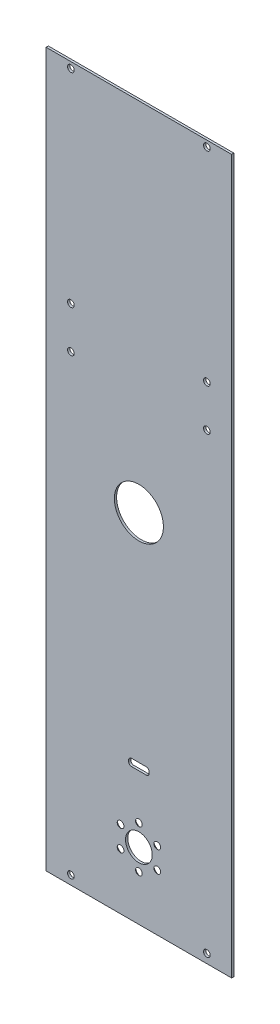
ISO-10303-21;
HEADER;
FILE_DESCRIPTION(('STEP AP214'),'2;1');
FILE_NAME('part.step','',(''),(''),'','','');
FILE_SCHEMA(('AUTOMOTIVE_DESIGN { 1 0 10303 214 1 1 1 1 }'));
ENDSEC;
DATA;
#1=APPLICATION_CONTEXT('core data for automotive mechanical design processes');
#2=APPLICATION_PROTOCOL_DEFINITION('international standard','automotive_design',2000,#1);
#3=PRODUCT_CONTEXT('',#1,'mechanical');
#4=PRODUCT('Part','Part','',(#3));
#5=PRODUCT_RELATED_PRODUCT_CATEGORY('part','',(#4));
#6=PRODUCT_DEFINITION_FORMATION('','',#4);
#7=PRODUCT_DEFINITION_CONTEXT('part definition',#1,'design');
#8=PRODUCT_DEFINITION('design','',#6,#7);
#9=PRODUCT_DEFINITION_SHAPE('','',#8);
#10=(LENGTH_UNIT() NAMED_UNIT(*) SI_UNIT(.MILLI.,.METRE.));
#11=(NAMED_UNIT(*) PLANE_ANGLE_UNIT() SI_UNIT($,.RADIAN.));
#12=(NAMED_UNIT(*) SI_UNIT($,.STERADIAN.) SOLID_ANGLE_UNIT());
#13=UNCERTAINTY_MEASURE_WITH_UNIT(LENGTH_MEASURE(1.E-05),#10,'distance_accuracy_value','');
#14=(GEOMETRIC_REPRESENTATION_CONTEXT(3) GLOBAL_UNCERTAINTY_ASSIGNED_CONTEXT((#13)) GLOBAL_UNIT_ASSIGNED_CONTEXT((#10,
#11,#12)) REPRESENTATION_CONTEXT('',''));
#15=CARTESIAN_POINT('',(0.,0.,0.));
#16=DIRECTION('',(0.,0.,1.));
#17=DIRECTION('',(1.,0.,0.));
#18=AXIS2_PLACEMENT_3D('',#15,#16,#17);
#19=CARTESIAN_POINT('',(-41.6,-160.,1.));
#20=DIRECTION('',(1.,0.,0.));
#21=DIRECTION('',(0.,0.,-1.));
#22=AXIS2_PLACEMENT_3D('',#19,#20,#21);
#23=PLANE('',#22);
#24=DIRECTION('',(0.,-1.,0.));
#25=VECTOR('',#24,1.);
#26=CARTESIAN_POINT('',(-41.6,-160.,0.));
#27=LINE('',#26,#25);
#28=CARTESIAN_POINT('',(-41.6,160.,0.));
#29=VERTEX_POINT('',#28);
#30=CARTESIAN_POINT('',(-41.6,-160.,0.));
#31=VERTEX_POINT('',#30);
#32=EDGE_CURVE('E266',#29,#31,#27,.T.);
#33=ORIENTED_EDGE('',*,*,#32,.T.);
#34=DIRECTION('',(0.,0.,-1.));
#35=VECTOR('',#34,1.);
#36=CARTESIAN_POINT('',(-41.6,-160.,1.));
#37=LINE('',#36,#35);
#38=CARTESIAN_POINT('',(-41.6,-160.,1.));
#39=VERTEX_POINT('',#38);
#40=EDGE_CURVE('E293',#39,#31,#37,.T.);
#41=ORIENTED_EDGE('',*,*,#40,.F.);
#42=DIRECTION('',(0.,-1.,0.));
#43=VECTOR('',#42,1.);
#44=CARTESIAN_POINT('',(-41.6,-160.,1.));
#45=LINE('',#44,#43);
#46=CARTESIAN_POINT('',(-41.6,160.,1.));
#47=VERTEX_POINT('',#46);
#48=EDGE_CURVE('E267',#47,#39,#45,.T.);
#49=ORIENTED_EDGE('',*,*,#48,.F.);
#50=DIRECTION('',(0.,0.,-1.));
#51=VECTOR('',#50,1.);
#52=CARTESIAN_POINT('',(-41.6,160.,1.));
#53=LINE('',#52,#51);
#54=EDGE_CURVE('E277',#47,#29,#53,.T.);
#55=ORIENTED_EDGE('',*,*,#54,.T.);
#56=EDGE_LOOP('',(#33,#41,#49,#55));
#57=FACE_BOUND('',#56,.T.);
#58=ADVANCED_FACE('F37',(#57),#23,.F.);
#59=CARTESIAN_POINT('',(41.6,-160.,1.));
#60=DIRECTION('',(0.,1.,0.));
#61=DIRECTION('',(-1.,0.,0.));
#62=AXIS2_PLACEMENT_3D('',#59,#60,#61);
#63=PLANE('',#62);
#64=DIRECTION('',(1.,0.,0.));
#65=VECTOR('',#64,1.);
#66=CARTESIAN_POINT('',(41.6,-160.,0.));
#67=LINE('',#66,#65);
#68=CARTESIAN_POINT('',(41.6,-160.,0.));
#69=VERTEX_POINT('',#68);
#70=EDGE_CURVE('E280',#31,#69,#67,.T.);
#71=ORIENTED_EDGE('',*,*,#70,.T.);
#72=DIRECTION('',(0.,0.,-1.));
#73=VECTOR('',#72,1.);
#74=CARTESIAN_POINT('',(41.6,-160.,1.));
#75=LINE('',#74,#73);
#76=CARTESIAN_POINT('',(41.6,-160.,1.));
#77=VERTEX_POINT('',#76);
#78=EDGE_CURVE('E290',#77,#69,#75,.T.);
#79=ORIENTED_EDGE('',*,*,#78,.F.);
#80=DIRECTION('',(1.,0.,0.));
#81=VECTOR('',#80,1.);
#82=CARTESIAN_POINT('',(41.6,-160.,1.));
#83=LINE('',#82,#81);
#84=EDGE_CURVE('E270',#39,#77,#83,.T.);
#85=ORIENTED_EDGE('',*,*,#84,.F.);
#86=ORIENTED_EDGE('',*,*,#40,.T.);
#87=EDGE_LOOP('',(#71,#79,#85,#86));
#88=FACE_BOUND('',#87,.T.);
#89=ADVANCED_FACE('F328',(#88),#63,.F.);
#90=CARTESIAN_POINT('',(41.6,-160.,1.));
#91=DIRECTION('',(-1.,0.,0.));
#92=DIRECTION('',(0.,0.,1.));
#93=AXIS2_PLACEMENT_3D('',#90,#91,#92);
#94=PLANE('',#93);
#95=DIRECTION('',(0.,1.,0.));
#96=VECTOR('',#95,1.);
#97=CARTESIAN_POINT('',(41.6,-160.,0.));
#98=LINE('',#97,#96);
#99=CARTESIAN_POINT('',(41.6,160.,0.));
#100=VERTEX_POINT('',#99);
#101=EDGE_CURVE('E282',#69,#100,#98,.T.);
#102=ORIENTED_EDGE('',*,*,#101,.T.);
#103=DIRECTION('',(0.,0.,-1.));
#104=VECTOR('',#103,1.);
#105=CARTESIAN_POINT('',(41.6,160.,1.));
#106=LINE('',#105,#104);
#107=CARTESIAN_POINT('',(41.6,160.,1.));
#108=VERTEX_POINT('',#107);
#109=EDGE_CURVE('E287',#108,#100,#106,.T.);
#110=ORIENTED_EDGE('',*,*,#109,.F.);
#111=DIRECTION('',(0.,1.,0.));
#112=VECTOR('',#111,1.);
#113=CARTESIAN_POINT('',(41.6,-160.,1.));
#114=LINE('',#113,#112);
#115=EDGE_CURVE('E273',#77,#108,#114,.T.);
#116=ORIENTED_EDGE('',*,*,#115,.F.);
#117=ORIENTED_EDGE('',*,*,#78,.T.);
#118=EDGE_LOOP('',(#102,#110,#116,#117));
#119=FACE_BOUND('',#118,.T.);
#120=ADVANCED_FACE('F334',(#119),#94,.F.);
#121=CARTESIAN_POINT('',(41.6,160.,1.));
#122=DIRECTION('',(0.,-1.,0.));
#123=DIRECTION('',(0.,0.,-1.));
#124=AXIS2_PLACEMENT_3D('',#121,#122,#123);
#125=PLANE('',#124);
#126=DIRECTION('',(-1.,0.,0.));
#127=VECTOR('',#126,1.);
#128=CARTESIAN_POINT('',(41.6,160.,0.));
#129=LINE('',#128,#127);
#130=EDGE_CURVE('E271',#100,#29,#129,.T.);
#131=ORIENTED_EDGE('',*,*,#130,.T.);
#132=ORIENTED_EDGE('',*,*,#54,.F.);
#133=DIRECTION('',(-1.,0.,0.));
#134=VECTOR('',#133,1.);
#135=CARTESIAN_POINT('',(41.6,160.,1.));
#136=LINE('',#135,#134);
#137=EDGE_CURVE('E275',#108,#47,#136,.T.);
#138=ORIENTED_EDGE('',*,*,#137,.F.);
#139=ORIENTED_EDGE('',*,*,#109,.T.);
#140=EDGE_LOOP('',(#131,#132,#138,#139));
#141=FACE_BOUND('',#140,.T.);
#142=ADVANCED_FACE('F393',(#141),#125,.F.);
#143=CARTESIAN_POINT('',(0.,0.,1.));
#144=DIRECTION('',(0.,0.,1.));
#145=DIRECTION('',(1.,0.,0.));
#146=AXIS2_PLACEMENT_3D('',#143,#144,#145);
#147=PLANE('',#146);
#148=CARTESIAN_POINT('',(3.29999999999995,-98.9966260203858,0.999999999999999));
#149=DIRECTION('',(0.,0.,1.));
#150=DIRECTION('',(1.,0.,0.));
#151=AXIS2_PLACEMENT_3D('',#148,#149,#150);
#152=CIRCLE('',#151,1.3);
#153=CARTESIAN_POINT('',(3.29999999999994,-100.296626020386,0.999999999999999));
#154=VERTEX_POINT('',#153);
#155=CARTESIAN_POINT('',(4.59999999999995,-98.9966260203858,0.999999999999999));
#156=VERTEX_POINT('',#155);
#157=EDGE_CURVE('E188',#154,#156,#152,.T.);
#158=ORIENTED_EDGE('',*,*,#157,.F.);
#159=DIRECTION('',(1.,0.,0.));
#160=VECTOR('',#159,1.);
#161=CARTESIAN_POINT('',(0.,-100.296626020386,1.));
#162=LINE('',#161,#160);
#163=CARTESIAN_POINT('',(-3.30000000000004,-100.296626020386,1.));
#164=VERTEX_POINT('',#163);
#165=EDGE_CURVE('E165',#164,#154,#162,.T.);
#166=ORIENTED_EDGE('',*,*,#165,.F.);
#167=CARTESIAN_POINT('',(-3.30000000000005,-98.9966260203858,0.999999999999999));
#168=DIRECTION('',(0.,0.,1.));
#169=DIRECTION('',(1.,0.,0.));
#170=AXIS2_PLACEMENT_3D('',#167,#168,#169);
#171=CIRCLE('',#170,1.3);
#172=CARTESIAN_POINT('',(-4.60000000000005,-98.9966260203858,0.999999999999999));
#173=VERTEX_POINT('',#172);
#174=EDGE_CURVE('E132',#173,#164,#171,.T.);
#175=ORIENTED_EDGE('',*,*,#174,.F.);
#176=DIRECTION('',(0.,-1.,0.));
#177=VECTOR('',#176,1.);
#178=CARTESIAN_POINT('',(-4.60000000000005,0.,1.));
#179=LINE('',#178,#177);
#180=CARTESIAN_POINT('',(-4.60000000000005,-98.3966260203858,0.999999999999999));
#181=VERTEX_POINT('',#180);
#182=EDGE_CURVE('E178',#181,#173,#179,.T.);
#183=ORIENTED_EDGE('',*,*,#182,.F.);
#184=CARTESIAN_POINT('',(-3.30000000000005,-98.3966260203858,0.999999999999999));
#185=DIRECTION('',(0.,0.,1.));
#186=DIRECTION('',(1.,0.,0.));
#187=AXIS2_PLACEMENT_3D('',#184,#185,#186);
#188=CIRCLE('',#187,1.3);
#189=CARTESIAN_POINT('',(-3.30000000000004,-97.0966260203858,0.999999999999999));
#190=VERTEX_POINT('',#189);
#191=EDGE_CURVE('E180',#190,#181,#188,.T.);
#192=ORIENTED_EDGE('',*,*,#191,.F.);
#193=DIRECTION('',(-1.,0.,0.));
#194=VECTOR('',#193,1.);
#195=CARTESIAN_POINT('',(0.,-97.0966260203858,1.));
#196=LINE('',#195,#194);
#197=CARTESIAN_POINT('',(3.29999999999994,-97.0966260203858,0.999999999999999));
#198=VERTEX_POINT('',#197);
#199=EDGE_CURVE('E182',#198,#190,#196,.T.);
#200=ORIENTED_EDGE('',*,*,#199,.F.);
#201=CARTESIAN_POINT('',(3.29999999999995,-98.3966260203858,0.999999999999999));
#202=DIRECTION('',(0.,0.,1.));
#203=DIRECTION('',(1.,0.,0.));
#204=AXIS2_PLACEMENT_3D('',#201,#202,#203);
#205=CIRCLE('',#204,1.3);
#206=CARTESIAN_POINT('',(4.59999999999995,-98.3966260203858,0.999999999999999));
#207=VERTEX_POINT('',#206);
#208=EDGE_CURVE('E184',#207,#198,#205,.T.);
#209=ORIENTED_EDGE('',*,*,#208,.F.);
#210=DIRECTION('',(0.,1.,0.));
#211=VECTOR('',#210,1.);
#212=CARTESIAN_POINT('',(4.59999999999995,0.,1.));
#213=LINE('',#212,#211);
#214=EDGE_CURVE('E186',#156,#207,#213,.T.);
#215=ORIENTED_EDGE('',*,*,#214,.F.);
#216=EDGE_LOOP('',(#158,#166,#175,#183,#192,#200,#209,#215));
#217=FACE_BOUND('',#216,.T.);
#218=CARTESIAN_POINT('',(8.22724133595211,-125.25,1.));
#219=DIRECTION('',(0.,0.,1.));
#220=DIRECTION('',(0.50000000000001,-0.866025403784433,0.));
#221=AXIS2_PLACEMENT_3D('',#218,#219,#220);
#222=CIRCLE('',#221,1.5);
#223=CARTESIAN_POINT('',(8.97724133595213,-126.549038105677,1.));
#224=VERTEX_POINT('',#223);
#225=EDGE_CURVE('E190',#224,#224,#222,.T.);
#226=ORIENTED_EDGE('',*,*,#225,.F.);
#227=EDGE_LOOP('',(#226));
#228=FACE_BOUND('',#227,.T.);
#229=CARTESIAN_POINT('',(8.22724133595221,-134.75,1.));
#230=DIRECTION('',(0.,0.,1.));
#231=DIRECTION('',(-0.499999999999992,-0.866025403784443,0.));
#232=AXIS2_PLACEMENT_3D('',#229,#230,#231);
#233=CIRCLE('',#232,1.5);
#234=CARTESIAN_POINT('',(7.47724133595222,-136.049038105677,1.));
#235=VERTEX_POINT('',#234);
#236=EDGE_CURVE('E198',#235,#235,#233,.T.);
#237=ORIENTED_EDGE('',*,*,#236,.F.);
#238=EDGE_LOOP('',(#237));
#239=FACE_BOUND('',#238,.T.);
#240=CARTESIAN_POINT('',(0.,-139.5,1.));
#241=DIRECTION('',(0.,0.,1.));
#242=DIRECTION('',(-1.,0.,0.));
#243=AXIS2_PLACEMENT_3D('',#240,#241,#242);
#244=CIRCLE('',#243,1.5);
#245=CARTESIAN_POINT('',(-1.5,-139.5,1.));
#246=VERTEX_POINT('',#245);
#247=EDGE_CURVE('E195',#246,#246,#244,.T.);
#248=ORIENTED_EDGE('',*,*,#247,.F.);
#249=EDGE_LOOP('',(#248));
#250=FACE_BOUND('',#249,.T.);
#251=CARTESIAN_POINT('',(-8.22724133595214,-134.75,1.));
#252=DIRECTION('',(0.,0.,1.));
#253=DIRECTION('',(-0.500000000000004,0.866025403784436,0.));
#254=AXIS2_PLACEMENT_3D('',#251,#252,#253);
#255=CIRCLE('',#254,1.5);
#256=CARTESIAN_POINT('',(-8.97724133595214,-133.450961894323,1.));
#257=VERTEX_POINT('',#256);
#258=EDGE_CURVE('E191',#257,#257,#255,.T.);
#259=ORIENTED_EDGE('',*,*,#258,.F.);
#260=EDGE_LOOP('',(#259));
#261=FACE_BOUND('',#260,.T.);
#262=CARTESIAN_POINT('',(-8.22724133595217,-125.25,1.));
#263=DIRECTION('',(0.,0.,1.));
#264=DIRECTION('',(0.499999999999998,0.86602540378444,0.));
#265=AXIS2_PLACEMENT_3D('',#262,#263,#264);
#266=CIRCLE('',#265,1.5);
#267=CARTESIAN_POINT('',(-7.47724133595217,-123.950961894323,1.));
#268=VERTEX_POINT('',#267);
#269=EDGE_CURVE('E194',#268,#268,#266,.T.);
#270=ORIENTED_EDGE('',*,*,#269,.F.);
#271=EDGE_LOOP('',(#270));
#272=FACE_BOUND('',#271,.T.);
#273=CARTESIAN_POINT('',(0.,-120.5,1.));
#274=DIRECTION('',(0.,0.,1.));
#275=DIRECTION('',(1.,0.,0.));
#276=AXIS2_PLACEMENT_3D('',#273,#274,#275);
#277=CIRCLE('',#276,1.5);
#278=CARTESIAN_POINT('',(1.5,-120.5,1.));
#279=VERTEX_POINT('',#278);
#280=EDGE_CURVE('E205',#279,#279,#277,.T.);
#281=ORIENTED_EDGE('',*,*,#280,.F.);
#282=EDGE_LOOP('',(#281));
#283=FACE_BOUND('',#282,.T.);
#284=CARTESIAN_POINT('',(0.,-130.,1.));
#285=DIRECTION('',(0.,0.,1.));
#286=DIRECTION('',(1.,0.,0.));
#287=AXIS2_PLACEMENT_3D('',#284,#285,#286);
#288=CIRCLE('',#287,6.);
#289=CARTESIAN_POINT('',(6.,-130.,1.));
#290=VERTEX_POINT('',#289);
#291=EDGE_CURVE('E208',#290,#290,#288,.T.);
#292=ORIENTED_EDGE('',*,*,#291,.F.);
#293=EDGE_LOOP('',(#292));
#294=FACE_BOUND('',#293,.T.);
#295=CARTESIAN_POINT('',(0.,0.,1.));
#296=DIRECTION('',(0.,0.,1.));
#297=DIRECTION('',(1.,0.,0.));
#298=AXIS2_PLACEMENT_3D('',#295,#296,#297);
#299=CIRCLE('',#298,11.);
#300=CARTESIAN_POINT('',(11.,0.,1.));
#301=VERTEX_POINT('',#300);
#302=EDGE_CURVE('E216',#301,#301,#299,.T.);
#303=ORIENTED_EDGE('',*,*,#302,.F.);
#304=EDGE_LOOP('',(#303));
#305=FACE_BOUND('',#304,.T.);
#306=CARTESIAN_POINT('',(-30.5,65.9999999999997,1.));
#307=DIRECTION('',(0.,0.,1.));
#308=DIRECTION('',(1.,0.,0.));
#309=AXIS2_PLACEMENT_3D('',#306,#307,#308);
#310=CIRCLE('',#309,1.5);
#311=CARTESIAN_POINT('',(-29.,65.9999999999997,1.));
#312=VERTEX_POINT('',#311);
#313=EDGE_CURVE('E215',#312,#312,#310,.T.);
#314=ORIENTED_EDGE('',*,*,#313,.F.);
#315=EDGE_LOOP('',(#314));
#316=FACE_BOUND('',#315,.T.);
#317=CARTESIAN_POINT('',(30.5,65.9999999999994,1.));
#318=DIRECTION('',(0.,0.,1.));
#319=DIRECTION('',(1.,0.,0.));
#320=AXIS2_PLACEMENT_3D('',#317,#318,#319);
#321=CIRCLE('',#320,1.5);
#322=CARTESIAN_POINT('',(32.,65.9999999999994,1.));
#323=VERTEX_POINT('',#322);
#324=EDGE_CURVE('E224',#323,#323,#321,.T.);
#325=ORIENTED_EDGE('',*,*,#324,.F.);
#326=EDGE_LOOP('',(#325));
#327=FACE_BOUND('',#326,.T.);
#328=CARTESIAN_POINT('',(30.5,-156.,1.));
#329=DIRECTION('',(0.,0.,1.));
#330=DIRECTION('',(1.,0.,0.));
#331=AXIS2_PLACEMENT_3D('',#328,#329,#330);
#332=CIRCLE('',#331,1.5);
#333=CARTESIAN_POINT('',(32.,-156.,1.));
#334=VERTEX_POINT('',#333);
#335=EDGE_CURVE('E230',#334,#334,#332,.T.);
#336=ORIENTED_EDGE('',*,*,#335,.F.);
#337=EDGE_LOOP('',(#336));
#338=FACE_BOUND('',#337,.T.);
#339=CARTESIAN_POINT('',(-30.5,-156.,1.));
#340=DIRECTION('',(0.,0.,1.));
#341=DIRECTION('',(1.,0.,0.));
#342=AXIS2_PLACEMENT_3D('',#339,#340,#341);
#343=CIRCLE('',#342,1.5);
#344=CARTESIAN_POINT('',(-29.,-156.,1.));
#345=VERTEX_POINT('',#344);
#346=EDGE_CURVE('E236',#345,#345,#343,.T.);
#347=ORIENTED_EDGE('',*,*,#346,.F.);
#348=EDGE_LOOP('',(#347));
#349=FACE_BOUND('',#348,.T.);
#350=CARTESIAN_POINT('',(-30.5,157.3,1.));
#351=DIRECTION('',(0.,0.,1.));
#352=DIRECTION('',(1.,0.,0.));
#353=AXIS2_PLACEMENT_3D('',#350,#351,#352);
#354=CIRCLE('',#353,1.5);
#355=CARTESIAN_POINT('',(-29.,157.3,1.));
#356=VERTEX_POINT('',#355);
#357=EDGE_CURVE('E242',#356,#356,#354,.T.);
#358=ORIENTED_EDGE('',*,*,#357,.F.);
#359=EDGE_LOOP('',(#358));
#360=FACE_BOUND('',#359,.T.);
#361=CARTESIAN_POINT('',(30.5,157.3,1.));
#362=DIRECTION('',(0.,0.,1.));
#363=DIRECTION('',(1.,0.,0.));
#364=AXIS2_PLACEMENT_3D('',#361,#362,#363);
#365=CIRCLE('',#364,1.5);
#366=CARTESIAN_POINT('',(32.,157.3,1.));
#367=VERTEX_POINT('',#366);
#368=EDGE_CURVE('E248',#367,#367,#365,.T.);
#369=ORIENTED_EDGE('',*,*,#368,.F.);
#370=EDGE_LOOP('',(#369));
#371=FACE_BOUND('',#370,.T.);
#372=CARTESIAN_POINT('',(-30.5000000000001,47.3,1.));
#373=DIRECTION('',(0.,0.,1.));
#374=DIRECTION('',(1.,0.,0.));
#375=AXIS2_PLACEMENT_3D('',#372,#373,#374);
#376=CIRCLE('',#375,1.5);
#377=CARTESIAN_POINT('',(-29.0000000000001,47.3,1.));
#378=VERTEX_POINT('',#377);
#379=EDGE_CURVE('E254',#378,#378,#376,.T.);
#380=ORIENTED_EDGE('',*,*,#379,.F.);
#381=EDGE_LOOP('',(#380));
#382=FACE_BOUND('',#381,.T.);
#383=CARTESIAN_POINT('',(30.5,47.3000000000001,1.));
#384=DIRECTION('',(0.,0.,1.));
#385=DIRECTION('',(1.,0.,0.));
#386=AXIS2_PLACEMENT_3D('',#383,#384,#385);
#387=CIRCLE('',#386,1.5);
#388=CARTESIAN_POINT('',(32.,47.3000000000001,1.));
#389=VERTEX_POINT('',#388);
#390=EDGE_CURVE('E260',#389,#389,#387,.T.);
#391=ORIENTED_EDGE('',*,*,#390,.F.);
#392=EDGE_LOOP('',(#391));
#393=FACE_BOUND('',#392,.T.);
#394=ORIENTED_EDGE('',*,*,#48,.T.);
#395=ORIENTED_EDGE('',*,*,#84,.T.);
#396=ORIENTED_EDGE('',*,*,#115,.T.);
#397=ORIENTED_EDGE('',*,*,#137,.T.);
#398=EDGE_LOOP('',(#394,#395,#396,#397));
#399=FACE_BOUND('',#398,.T.);
#400=ADVANCED_FACE('F359',(#217,#228,#239,#250,#261,#272,#283,#294,#305,#316,#327,#338,#349,
#360,#371,#382,#393,#399),#147,.T.);
#401=CARTESIAN_POINT('',(0.,0.,0.));
#402=DIRECTION('',(0.,0.,1.));
#403=DIRECTION('',(1.,0.,0.));
#404=AXIS2_PLACEMENT_3D('',#401,#402,#403);
#405=PLANE('',#404);
#406=DIRECTION('',(-1.,0.,0.));
#407=VECTOR('',#406,1.);
#408=CARTESIAN_POINT('',(3.29999999999994,-100.296626020386,0.));
#409=LINE('',#408,#407);
#410=CARTESIAN_POINT('',(3.29999999999994,-100.296626020386,0.));
#411=VERTEX_POINT('',#410);
#412=CARTESIAN_POINT('',(-3.30000000000004,-100.296626020386,0.));
#413=VERTEX_POINT('',#412);
#414=EDGE_CURVE('E138',#411,#413,#409,.T.);
#415=ORIENTED_EDGE('',*,*,#414,.F.);
#416=CARTESIAN_POINT('',(3.29999999999995,-98.9966260203858,0.));
#417=DIRECTION('',(0.,0.,-1.));
#418=DIRECTION('',(-1.,0.,0.));
#419=AXIS2_PLACEMENT_3D('',#416,#417,#418);
#420=CIRCLE('',#419,1.3);
#421=CARTESIAN_POINT('',(4.59999999999995,-98.9966260203858,0.));
#422=VERTEX_POINT('',#421);
#423=EDGE_CURVE('E60',#422,#411,#420,.T.);
#424=ORIENTED_EDGE('',*,*,#423,.F.);
#425=DIRECTION('',(0.,-1.,0.));
#426=VECTOR('',#425,1.);
#427=CARTESIAN_POINT('',(4.59999999999995,-98.9966260203858,0.));
#428=LINE('',#427,#426);
#429=CARTESIAN_POINT('',(4.59999999999995,-98.3966260203858,0.));
#430=VERTEX_POINT('',#429);
#431=EDGE_CURVE('E160',#430,#422,#428,.T.);
#432=ORIENTED_EDGE('',*,*,#431,.F.);
#433=CARTESIAN_POINT('',(3.29999999999995,-98.3966260203858,0.));
#434=DIRECTION('',(0.,0.,-1.));
#435=DIRECTION('',(1.,0.,0.));
#436=AXIS2_PLACEMENT_3D('',#433,#434,#435);
#437=CIRCLE('',#436,1.3);
#438=CARTESIAN_POINT('',(3.29999999999994,-97.0966260203858,0.));
#439=VERTEX_POINT('',#438);
#440=EDGE_CURVE('E157',#439,#430,#437,.T.);
#441=ORIENTED_EDGE('',*,*,#440,.F.);
#442=DIRECTION('',(1.,0.,0.));
#443=VECTOR('',#442,1.);
#444=CARTESIAN_POINT('',(3.29999999999994,-97.0966260203858,0.));
#445=LINE('',#444,#443);
#446=CARTESIAN_POINT('',(-3.30000000000004,-97.0966260203858,0.));
#447=VERTEX_POINT('',#446);
#448=EDGE_CURVE('E154',#447,#439,#445,.T.);
#449=ORIENTED_EDGE('',*,*,#448,.F.);
#450=CARTESIAN_POINT('',(-3.30000000000005,-98.3966260203858,0.));
#451=DIRECTION('',(0.,0.,-1.));
#452=DIRECTION('',(-1.,0.,0.));
#453=AXIS2_PLACEMENT_3D('',#450,#451,#452);
#454=CIRCLE('',#453,1.3);
#455=CARTESIAN_POINT('',(-4.60000000000005,-98.3966260203858,0.));
#456=VERTEX_POINT('',#455);
#457=EDGE_CURVE('E148',#456,#447,#454,.T.);
#458=ORIENTED_EDGE('',*,*,#457,.F.);
#459=DIRECTION('',(0.,1.,0.));
#460=VECTOR('',#459,1.);
#461=CARTESIAN_POINT('',(-4.60000000000005,-98.9966260203858,0.));
#462=LINE('',#461,#460);
#463=CARTESIAN_POINT('',(-4.60000000000005,-98.9966260203858,0.));
#464=VERTEX_POINT('',#463);
#465=EDGE_CURVE('E146',#464,#456,#462,.T.);
#466=ORIENTED_EDGE('',*,*,#465,.F.);
#467=CARTESIAN_POINT('',(-3.30000000000005,-98.9966260203858,0.));
#468=DIRECTION('',(0.,0.,-1.));
#469=DIRECTION('',(-1.,0.,0.));
#470=AXIS2_PLACEMENT_3D('',#467,#468,#469);
#471=CIRCLE('',#470,1.3);
#472=EDGE_CURVE('E129',#413,#464,#471,.T.);
#473=ORIENTED_EDGE('',*,*,#472,.F.);
#474=EDGE_LOOP('',(#415,#424,#432,#441,#449,#458,#466,#473));
#475=FACE_BOUND('',#474,.T.);
#476=CARTESIAN_POINT('',(8.22724133595211,-125.25,0.));
#477=DIRECTION('',(0.,0.,1.));
#478=DIRECTION('',(1.,0.,0.));
#479=AXIS2_PLACEMENT_3D('',#476,#477,#478);
#480=CIRCLE('',#479,2.5);
#481=CARTESIAN_POINT('',(10.7272413359521,-125.25,0.));
#482=VERTEX_POINT('',#481);
#483=EDGE_CURVE('E11',#482,#482,#480,.T.);
#484=ORIENTED_EDGE('',*,*,#483,.T.);
#485=EDGE_LOOP('',(#484));
#486=FACE_BOUND('',#485,.T.);
#487=CARTESIAN_POINT('',(8.22724133595221,-134.75,0.));
#488=DIRECTION('',(0.,0.,1.));
#489=DIRECTION('',(1.,0.,0.));
#490=AXIS2_PLACEMENT_3D('',#487,#488,#489);
#491=CIRCLE('',#490,2.5);
#492=CARTESIAN_POINT('',(10.7272413359522,-134.75,0.));
#493=VERTEX_POINT('',#492);
#494=EDGE_CURVE('E45',#493,#493,#491,.T.);
#495=ORIENTED_EDGE('',*,*,#494,.T.);
#496=EDGE_LOOP('',(#495));
#497=FACE_BOUND('',#496,.T.);
#498=CARTESIAN_POINT('',(0.,-139.5,0.));
#499=DIRECTION('',(0.,0.,1.));
#500=DIRECTION('',(1.,0.,0.));
#501=AXIS2_PLACEMENT_3D('',#498,#499,#500);
#502=CIRCLE('',#501,2.5);
#503=CARTESIAN_POINT('',(2.5,-139.5,0.));
#504=VERTEX_POINT('',#503);
#505=EDGE_CURVE('E307',#504,#504,#502,.T.);
#506=ORIENTED_EDGE('',*,*,#505,.T.);
#507=EDGE_LOOP('',(#506));
#508=FACE_BOUND('',#507,.T.);
#509=CARTESIAN_POINT('',(-8.22724133595214,-134.75,0.));
#510=DIRECTION('',(0.,0.,1.));
#511=DIRECTION('',(1.,0.,0.));
#512=AXIS2_PLACEMENT_3D('',#509,#510,#511);
#513=CIRCLE('',#512,2.5);
#514=CARTESIAN_POINT('',(-5.72724133595213,-134.75,0.));
#515=VERTEX_POINT('',#514);
#516=EDGE_CURVE('E304',#515,#515,#513,.T.);
#517=ORIENTED_EDGE('',*,*,#516,.T.);
#518=EDGE_LOOP('',(#517));
#519=FACE_BOUND('',#518,.T.);
#520=CARTESIAN_POINT('',(-8.22724133595217,-125.25,0.));
#521=DIRECTION('',(0.,0.,1.));
#522=DIRECTION('',(1.,0.,0.));
#523=AXIS2_PLACEMENT_3D('',#520,#521,#522);
#524=CIRCLE('',#523,2.5);
#525=CARTESIAN_POINT('',(-5.72724133595216,-125.25,0.));
#526=VERTEX_POINT('',#525);
#527=EDGE_CURVE('E301',#526,#526,#524,.T.);
#528=ORIENTED_EDGE('',*,*,#527,.T.);
#529=EDGE_LOOP('',(#528));
#530=FACE_BOUND('',#529,.T.);
#531=CARTESIAN_POINT('',(0.,-120.5,0.));
#532=DIRECTION('',(0.,0.,1.));
#533=DIRECTION('',(1.,0.,0.));
#534=AXIS2_PLACEMENT_3D('',#531,#532,#533);
#535=CIRCLE('',#534,2.5);
#536=CARTESIAN_POINT('',(2.5,-120.5,0.));
#537=VERTEX_POINT('',#536);
#538=EDGE_CURVE('E296',#537,#537,#535,.T.);
#539=ORIENTED_EDGE('',*,*,#538,.T.);
#540=EDGE_LOOP('',(#539));
#541=FACE_BOUND('',#540,.T.);
#542=CARTESIAN_POINT('',(0.,-130.,0.));
#543=DIRECTION('',(0.,0.,1.));
#544=DIRECTION('',(1.,0.,0.));
#545=AXIS2_PLACEMENT_3D('',#542,#543,#544);
#546=CIRCLE('',#545,6.);
#547=CARTESIAN_POINT('',(6.,-130.,0.));
#548=VERTEX_POINT('',#547);
#549=EDGE_CURVE('E211',#548,#548,#546,.T.);
#550=ORIENTED_EDGE('',*,*,#549,.T.);
#551=EDGE_LOOP('',(#550));
#552=FACE_BOUND('',#551,.T.);
#553=CARTESIAN_POINT('',(0.,0.,0.));
#554=DIRECTION('',(0.,0.,1.));
#555=DIRECTION('',(1.,0.,0.));
#556=AXIS2_PLACEMENT_3D('',#553,#554,#555);
#557=CIRCLE('',#556,11.);
#558=CARTESIAN_POINT('',(11.,0.,0.));
#559=VERTEX_POINT('',#558);
#560=EDGE_CURVE('E212',#559,#559,#557,.T.);
#561=ORIENTED_EDGE('',*,*,#560,.T.);
#562=EDGE_LOOP('',(#561));
#563=FACE_BOUND('',#562,.T.);
#564=CARTESIAN_POINT('',(-30.5,65.9999999999997,0.));
#565=DIRECTION('',(0.,0.,1.));
#566=DIRECTION('',(1.,0.,0.));
#567=AXIS2_PLACEMENT_3D('',#564,#565,#566);
#568=CIRCLE('',#567,1.5);
#569=CARTESIAN_POINT('',(-29.,65.9999999999997,0.));
#570=VERTEX_POINT('',#569);
#571=EDGE_CURVE('E221',#570,#570,#568,.T.);
#572=ORIENTED_EDGE('',*,*,#571,.T.);
#573=EDGE_LOOP('',(#572));
#574=FACE_BOUND('',#573,.T.);
#575=CARTESIAN_POINT('',(30.5,65.9999999999994,0.));
#576=DIRECTION('',(0.,0.,1.));
#577=DIRECTION('',(1.,0.,0.));
#578=AXIS2_PLACEMENT_3D('',#575,#576,#577);
#579=CIRCLE('',#578,1.5);
#580=CARTESIAN_POINT('',(32.,65.9999999999994,0.));
#581=VERTEX_POINT('',#580);
#582=EDGE_CURVE('E227',#581,#581,#579,.T.);
#583=ORIENTED_EDGE('',*,*,#582,.T.);
#584=EDGE_LOOP('',(#583));
#585=FACE_BOUND('',#584,.T.);
#586=CARTESIAN_POINT('',(30.5,-156.,0.));
#587=DIRECTION('',(0.,0.,1.));
#588=DIRECTION('',(1.,0.,0.));
#589=AXIS2_PLACEMENT_3D('',#586,#587,#588);
#590=CIRCLE('',#589,1.5);
#591=CARTESIAN_POINT('',(32.,-156.,0.));
#592=VERTEX_POINT('',#591);
#593=EDGE_CURVE('E233',#592,#592,#590,.T.);
#594=ORIENTED_EDGE('',*,*,#593,.T.);
#595=EDGE_LOOP('',(#594));
#596=FACE_BOUND('',#595,.T.);
#597=CARTESIAN_POINT('',(-30.5,-156.,0.));
#598=DIRECTION('',(0.,0.,1.));
#599=DIRECTION('',(1.,0.,0.));
#600=AXIS2_PLACEMENT_3D('',#597,#598,#599);
#601=CIRCLE('',#600,1.5);
#602=CARTESIAN_POINT('',(-29.,-156.,0.));
#603=VERTEX_POINT('',#602);
#604=EDGE_CURVE('E239',#603,#603,#601,.T.);
#605=ORIENTED_EDGE('',*,*,#604,.T.);
#606=EDGE_LOOP('',(#605));
#607=FACE_BOUND('',#606,.T.);
#608=CARTESIAN_POINT('',(-30.5,157.3,0.));
#609=DIRECTION('',(0.,0.,1.));
#610=DIRECTION('',(1.,0.,0.));
#611=AXIS2_PLACEMENT_3D('',#608,#609,#610);
#612=CIRCLE('',#611,1.5);
#613=CARTESIAN_POINT('',(-29.,157.3,0.));
#614=VERTEX_POINT('',#613);
#615=EDGE_CURVE('E245',#614,#614,#612,.T.);
#616=ORIENTED_EDGE('',*,*,#615,.T.);
#617=EDGE_LOOP('',(#616));
#618=FACE_BOUND('',#617,.T.);
#619=CARTESIAN_POINT('',(30.5,157.3,0.));
#620=DIRECTION('',(0.,0.,1.));
#621=DIRECTION('',(1.,0.,0.));
#622=AXIS2_PLACEMENT_3D('',#619,#620,#621);
#623=CIRCLE('',#622,1.5);
#624=CARTESIAN_POINT('',(32.,157.3,0.));
#625=VERTEX_POINT('',#624);
#626=EDGE_CURVE('E251',#625,#625,#623,.T.);
#627=ORIENTED_EDGE('',*,*,#626,.T.);
#628=EDGE_LOOP('',(#627));
#629=FACE_BOUND('',#628,.T.);
#630=CARTESIAN_POINT('',(-30.5000000000001,47.3,0.));
#631=DIRECTION('',(0.,0.,1.));
#632=DIRECTION('',(1.,0.,0.));
#633=AXIS2_PLACEMENT_3D('',#630,#631,#632);
#634=CIRCLE('',#633,1.5);
#635=CARTESIAN_POINT('',(-29.0000000000001,47.3,0.));
#636=VERTEX_POINT('',#635);
#637=EDGE_CURVE('E257',#636,#636,#634,.T.);
#638=ORIENTED_EDGE('',*,*,#637,.T.);
#639=EDGE_LOOP('',(#638));
#640=FACE_BOUND('',#639,.T.);
#641=CARTESIAN_POINT('',(30.5,47.3000000000001,0.));
#642=DIRECTION('',(0.,0.,1.));
#643=DIRECTION('',(1.,0.,0.));
#644=AXIS2_PLACEMENT_3D('',#641,#642,#643);
#645=CIRCLE('',#644,1.5);
#646=CARTESIAN_POINT('',(32.,47.3000000000001,0.));
#647=VERTEX_POINT('',#646);
#648=EDGE_CURVE('E263',#647,#647,#645,.T.);
#649=ORIENTED_EDGE('',*,*,#648,.T.);
#650=EDGE_LOOP('',(#649));
#651=FACE_BOUND('',#650,.T.);
#652=ORIENTED_EDGE('',*,*,#32,.F.);
#653=ORIENTED_EDGE('',*,*,#130,.F.);
#654=ORIENTED_EDGE('',*,*,#101,.F.);
#655=ORIENTED_EDGE('',*,*,#70,.F.);
#656=EDGE_LOOP('',(#652,#653,#654,#655));
#657=FACE_BOUND('',#656,.T.);
#658=ADVANCED_FACE('F142',(#475,#486,#497,#508,#519,#530,#541,#552,#563,#574,#585,#596,#607,
#618,#629,#640,#651,#657),#405,.F.);
#659=CARTESIAN_POINT('',(30.5,47.3000000000001,1.));
#660=DIRECTION('',(0.,0.,1.));
#661=DIRECTION('',(1.,0.,0.));
#662=AXIS2_PLACEMENT_3D('',#659,#660,#661);
#663=CYLINDRICAL_SURFACE('',#662,1.5);
#664=ORIENTED_EDGE('',*,*,#648,.F.);
#665=EDGE_LOOP('',(#664));
#666=FACE_BOUND('',#665,.T.);
#667=ORIENTED_EDGE('',*,*,#390,.T.);
#668=EDGE_LOOP('',(#667));
#669=FACE_BOUND('',#668,.T.);
#670=ADVANCED_FACE('F358',(#666,#669),#663,.F.);
#671=CARTESIAN_POINT('',(-30.5000000000001,47.3,1.));
#672=DIRECTION('',(0.,0.,1.));
#673=DIRECTION('',(1.,0.,0.));
#674=AXIS2_PLACEMENT_3D('',#671,#672,#673);
#675=CYLINDRICAL_SURFACE('',#674,1.5);
#676=ORIENTED_EDGE('',*,*,#637,.F.);
#677=EDGE_LOOP('',(#676));
#678=FACE_BOUND('',#677,.T.);
#679=ORIENTED_EDGE('',*,*,#379,.T.);
#680=EDGE_LOOP('',(#679));
#681=FACE_BOUND('',#680,.T.);
#682=ADVANCED_FACE('F438',(#678,#681),#675,.F.);
#683=CARTESIAN_POINT('',(30.5,157.3,1.));
#684=DIRECTION('',(0.,0.,1.));
#685=DIRECTION('',(1.,0.,0.));
#686=AXIS2_PLACEMENT_3D('',#683,#684,#685);
#687=CYLINDRICAL_SURFACE('',#686,1.5);
#688=ORIENTED_EDGE('',*,*,#626,.F.);
#689=EDGE_LOOP('',(#688));
#690=FACE_BOUND('',#689,.T.);
#691=ORIENTED_EDGE('',*,*,#368,.T.);
#692=EDGE_LOOP('',(#691));
#693=FACE_BOUND('',#692,.T.);
#694=ADVANCED_FACE('F444',(#690,#693),#687,.F.);
#695=CARTESIAN_POINT('',(-30.5,157.3,1.));
#696=DIRECTION('',(0.,0.,1.));
#697=DIRECTION('',(1.,0.,0.));
#698=AXIS2_PLACEMENT_3D('',#695,#696,#697);
#699=CYLINDRICAL_SURFACE('',#698,1.5);
#700=ORIENTED_EDGE('',*,*,#615,.F.);
#701=EDGE_LOOP('',(#700));
#702=FACE_BOUND('',#701,.T.);
#703=ORIENTED_EDGE('',*,*,#357,.T.);
#704=EDGE_LOOP('',(#703));
#705=FACE_BOUND('',#704,.T.);
#706=ADVANCED_FACE('F451',(#702,#705),#699,.F.);
#707=CARTESIAN_POINT('',(-30.5,-156.,1.));
#708=DIRECTION('',(0.,0.,1.));
#709=DIRECTION('',(1.,0.,0.));
#710=AXIS2_PLACEMENT_3D('',#707,#708,#709);
#711=CYLINDRICAL_SURFACE('',#710,1.5);
#712=ORIENTED_EDGE('',*,*,#604,.F.);
#713=EDGE_LOOP('',(#712));
#714=FACE_BOUND('',#713,.T.);
#715=ORIENTED_EDGE('',*,*,#346,.T.);
#716=EDGE_LOOP('',(#715));
#717=FACE_BOUND('',#716,.T.);
#718=ADVANCED_FACE('F459',(#714,#717),#711,.F.);
#719=CARTESIAN_POINT('',(30.5,-156.,1.));
#720=DIRECTION('',(0.,0.,1.));
#721=DIRECTION('',(1.,0.,0.));
#722=AXIS2_PLACEMENT_3D('',#719,#720,#721);
#723=CYLINDRICAL_SURFACE('',#722,1.5);
#724=ORIENTED_EDGE('',*,*,#593,.F.);
#725=EDGE_LOOP('',(#724));
#726=FACE_BOUND('',#725,.T.);
#727=ORIENTED_EDGE('',*,*,#335,.T.);
#728=EDGE_LOOP('',(#727));
#729=FACE_BOUND('',#728,.T.);
#730=ADVANCED_FACE('F467',(#726,#729),#723,.F.);
#731=CARTESIAN_POINT('',(30.5,65.9999999999994,1.));
#732=DIRECTION('',(0.,0.,1.));
#733=DIRECTION('',(1.,0.,0.));
#734=AXIS2_PLACEMENT_3D('',#731,#732,#733);
#735=CYLINDRICAL_SURFACE('',#734,1.5);
#736=ORIENTED_EDGE('',*,*,#582,.F.);
#737=EDGE_LOOP('',(#736));
#738=FACE_BOUND('',#737,.T.);
#739=ORIENTED_EDGE('',*,*,#324,.T.);
#740=EDGE_LOOP('',(#739));
#741=FACE_BOUND('',#740,.T.);
#742=ADVANCED_FACE('F475',(#738,#741),#735,.F.);
#743=CARTESIAN_POINT('',(-30.5,65.9999999999997,1.));
#744=DIRECTION('',(0.,0.,1.));
#745=DIRECTION('',(1.,0.,0.));
#746=AXIS2_PLACEMENT_3D('',#743,#744,#745);
#747=CYLINDRICAL_SURFACE('',#746,1.5);
#748=ORIENTED_EDGE('',*,*,#571,.F.);
#749=EDGE_LOOP('',(#748));
#750=FACE_BOUND('',#749,.T.);
#751=ORIENTED_EDGE('',*,*,#313,.T.);
#752=EDGE_LOOP('',(#751));
#753=FACE_BOUND('',#752,.T.);
#754=ADVANCED_FACE('F483',(#750,#753),#747,.F.);
#755=CARTESIAN_POINT('',(0.,0.,0.));
#756=DIRECTION('',(0.,0.,1.));
#757=DIRECTION('',(1.,0.,0.));
#758=AXIS2_PLACEMENT_3D('',#755,#756,#757);
#759=CYLINDRICAL_SURFACE('',#758,11.);
#760=ORIENTED_EDGE('',*,*,#560,.F.);
#761=EDGE_LOOP('',(#760));
#762=FACE_BOUND('',#761,.T.);
#763=ORIENTED_EDGE('',*,*,#302,.T.);
#764=EDGE_LOOP('',(#763));
#765=FACE_BOUND('',#764,.T.);
#766=ADVANCED_FACE('F491',(#762,#765),#759,.F.);
#767=CARTESIAN_POINT('',(0.,-130.,-9.));
#768=DIRECTION('',(0.,0.,1.));
#769=DIRECTION('',(1.,0.,0.));
#770=AXIS2_PLACEMENT_3D('',#767,#768,#769);
#771=CYLINDRICAL_SURFACE('',#770,6.);
#772=ORIENTED_EDGE('',*,*,#291,.T.);
#773=EDGE_LOOP('',(#772));
#774=FACE_BOUND('',#773,.T.);
#775=ORIENTED_EDGE('',*,*,#549,.F.);
#776=EDGE_LOOP('',(#775));
#777=FACE_BOUND('',#776,.T.);
#778=ADVANCED_FACE('F343',(#774,#777),#771,.F.);
#779=CARTESIAN_POINT('',(0.,-120.5,0.));
#780=DIRECTION('',(0.,0.,-1.));
#781=DIRECTION('',(-1.,0.,0.));
#782=AXIS2_PLACEMENT_3D('',#779,#780,#781);
#783=CONICAL_SURFACE('',#782,2.5,0.785398163397437);
#784=ORIENTED_EDGE('',*,*,#280,.T.);
#785=EDGE_LOOP('',(#784));
#786=FACE_BOUND('',#785,.T.);
#787=ORIENTED_EDGE('',*,*,#538,.F.);
#788=EDGE_LOOP('',(#787));
#789=FACE_BOUND('',#788,.T.);
#790=ADVANCED_FACE('F339',(#786,#789),#783,.F.);
#791=CARTESIAN_POINT('',(-8.22724133595217,-125.25,0.));
#792=DIRECTION('',(0.,0.,-1.));
#793=DIRECTION('',(-1.,0.,0.));
#794=AXIS2_PLACEMENT_3D('',#791,#792,#793);
#795=CONICAL_SURFACE('',#794,2.5,0.785398163397437);
#796=ORIENTED_EDGE('',*,*,#269,.T.);
#797=EDGE_LOOP('',(#796));
#798=FACE_BOUND('',#797,.T.);
#799=ORIENTED_EDGE('',*,*,#527,.F.);
#800=EDGE_LOOP('',(#799));
#801=FACE_BOUND('',#800,.T.);
#802=ADVANCED_FACE('F342',(#798,#801),#795,.F.);
#803=CARTESIAN_POINT('',(-8.22724133595214,-134.75,0.));
#804=DIRECTION('',(0.,0.,-1.));
#805=DIRECTION('',(-1.,0.,0.));
#806=AXIS2_PLACEMENT_3D('',#803,#804,#805);
#807=CONICAL_SURFACE('',#806,2.5,0.785398163397437);
#808=ORIENTED_EDGE('',*,*,#258,.T.);
#809=EDGE_LOOP('',(#808));
#810=FACE_BOUND('',#809,.T.);
#811=ORIENTED_EDGE('',*,*,#516,.F.);
#812=EDGE_LOOP('',(#811));
#813=FACE_BOUND('',#812,.T.);
#814=ADVANCED_FACE('F324',(#810,#813),#807,.F.);
#815=CARTESIAN_POINT('',(0.,-139.5,0.));
#816=DIRECTION('',(0.,0.,-1.));
#817=DIRECTION('',(-1.,0.,0.));
#818=AXIS2_PLACEMENT_3D('',#815,#816,#817);
#819=CONICAL_SURFACE('',#818,2.5,0.785398163397437);
#820=ORIENTED_EDGE('',*,*,#247,.T.);
#821=EDGE_LOOP('',(#820));
#822=FACE_BOUND('',#821,.T.);
#823=ORIENTED_EDGE('',*,*,#505,.F.);
#824=EDGE_LOOP('',(#823));
#825=FACE_BOUND('',#824,.T.);
#826=ADVANCED_FACE('F316',(#822,#825),#819,.F.);
#827=CARTESIAN_POINT('',(8.22724133595221,-134.75,0.));
#828=DIRECTION('',(0.,0.,-1.));
#829=DIRECTION('',(-1.,0.,0.));
#830=AXIS2_PLACEMENT_3D('',#827,#828,#829);
#831=CONICAL_SURFACE('',#830,2.5,0.785398163397437);
#832=ORIENTED_EDGE('',*,*,#236,.T.);
#833=EDGE_LOOP('',(#832));
#834=FACE_BOUND('',#833,.T.);
#835=ORIENTED_EDGE('',*,*,#494,.F.);
#836=EDGE_LOOP('',(#835));
#837=FACE_BOUND('',#836,.T.);
#838=ADVANCED_FACE('F314',(#834,#837),#831,.F.);
#839=CARTESIAN_POINT('',(8.22724133595211,-125.25,0.));
#840=DIRECTION('',(0.,0.,-1.));
#841=DIRECTION('',(-1.,0.,0.));
#842=AXIS2_PLACEMENT_3D('',#839,#840,#841);
#843=CONICAL_SURFACE('',#842,2.5,0.785398163397437);
#844=ORIENTED_EDGE('',*,*,#225,.T.);
#845=EDGE_LOOP('',(#844));
#846=FACE_BOUND('',#845,.T.);
#847=ORIENTED_EDGE('',*,*,#483,.F.);
#848=EDGE_LOOP('',(#847));
#849=FACE_BOUND('',#848,.T.);
#850=ADVANCED_FACE('F39',(#846,#849),#843,.F.);
#851=CARTESIAN_POINT('',(3.29999999999995,-98.9966260203858,10.));
#852=DIRECTION('',(0.,0.,-1.));
#853=DIRECTION('',(-1.,0.,0.));
#854=AXIS2_PLACEMENT_3D('',#851,#852,#853);
#855=CYLINDRICAL_SURFACE('',#854,1.3);
#856=ORIENTED_EDGE('',*,*,#157,.T.);
#857=DIRECTION('',(0.,0.,-1.));
#858=VECTOR('',#857,1.);
#859=CARTESIAN_POINT('',(4.59999999999995,-98.9966260203858,10.));
#860=LINE('',#859,#858);
#861=EDGE_CURVE('E163',#156,#422,#860,.T.);
#862=ORIENTED_EDGE('',*,*,#861,.T.);
#863=ORIENTED_EDGE('',*,*,#423,.T.);
#864=DIRECTION('',(0.,0.,-1.));
#865=VECTOR('',#864,1.);
#866=CARTESIAN_POINT('',(3.29999999999994,-100.296626020386,10.));
#867=LINE('',#866,#865);
#868=EDGE_CURVE('E135',#154,#411,#867,.T.);
#869=ORIENTED_EDGE('',*,*,#868,.F.);
#870=EDGE_LOOP('',(#856,#862,#863,#869));
#871=FACE_BOUND('',#870,.T.);
#872=ADVANCED_FACE('F322',(#871),#855,.F.);
#873=CARTESIAN_POINT('',(4.59999999999995,-98.9966260203858,10.));
#874=DIRECTION('',(1.,0.,0.));
#875=DIRECTION('',(0.,0.,-1.));
#876=AXIS2_PLACEMENT_3D('',#873,#874,#875);
#877=PLANE('',#876);
#878=ORIENTED_EDGE('',*,*,#214,.T.);
#879=DIRECTION('',(0.,0.,-1.));
#880=VECTOR('',#879,1.);
#881=CARTESIAN_POINT('',(4.59999999999995,-98.3966260203858,10.));
#882=LINE('',#881,#880);
#883=EDGE_CURVE('E166',#207,#430,#882,.T.);
#884=ORIENTED_EDGE('',*,*,#883,.T.);
#885=ORIENTED_EDGE('',*,*,#431,.T.);
#886=ORIENTED_EDGE('',*,*,#861,.F.);
#887=EDGE_LOOP('',(#878,#884,#885,#886));
#888=FACE_BOUND('',#887,.T.);
#889=ADVANCED_FACE('F542',(#888),#877,.F.);
#890=CARTESIAN_POINT('',(3.29999999999995,-98.3966260203858,10.));
#891=DIRECTION('',(0.,0.,-1.));
#892=DIRECTION('',(-1.,0.,0.));
#893=AXIS2_PLACEMENT_3D('',#890,#891,#892);
#894=CYLINDRICAL_SURFACE('',#893,1.3);
#895=ORIENTED_EDGE('',*,*,#208,.T.);
#896=DIRECTION('',(0.,0.,-1.));
#897=VECTOR('',#896,1.);
#898=CARTESIAN_POINT('',(3.29999999999994,-97.0966260203858,10.));
#899=LINE('',#898,#897);
#900=EDGE_CURVE('E168',#198,#439,#899,.T.);
#901=ORIENTED_EDGE('',*,*,#900,.T.);
#902=ORIENTED_EDGE('',*,*,#440,.T.);
#903=ORIENTED_EDGE('',*,*,#883,.F.);
#904=EDGE_LOOP('',(#895,#901,#902,#903));
#905=FACE_BOUND('',#904,.T.);
#906=ADVANCED_FACE('F548',(#905),#894,.F.);
#907=CARTESIAN_POINT('',(3.29999999999994,-97.0966260203858,10.));
#908=DIRECTION('',(0.,1.,0.));
#909=DIRECTION('',(0.,0.,1.));
#910=AXIS2_PLACEMENT_3D('',#907,#908,#909);
#911=PLANE('',#910);
#912=ORIENTED_EDGE('',*,*,#199,.T.);
#913=DIRECTION('',(0.,0.,-1.));
#914=VECTOR('',#913,1.);
#915=CARTESIAN_POINT('',(-3.30000000000004,-97.0966260203858,10.));
#916=LINE('',#915,#914);
#917=EDGE_CURVE('E170',#190,#447,#916,.T.);
#918=ORIENTED_EDGE('',*,*,#917,.T.);
#919=ORIENTED_EDGE('',*,*,#448,.T.);
#920=ORIENTED_EDGE('',*,*,#900,.F.);
#921=EDGE_LOOP('',(#912,#918,#919,#920));
#922=FACE_BOUND('',#921,.T.);
#923=ADVANCED_FACE('F556',(#922),#911,.F.);
#924=CARTESIAN_POINT('',(-3.30000000000005,-98.3966260203858,10.));
#925=DIRECTION('',(0.,0.,-1.));
#926=DIRECTION('',(-1.,0.,0.));
#927=AXIS2_PLACEMENT_3D('',#924,#925,#926);
#928=CYLINDRICAL_SURFACE('',#927,1.3);
#929=ORIENTED_EDGE('',*,*,#191,.T.);
#930=DIRECTION('',(0.,0.,-1.));
#931=VECTOR('',#930,1.);
#932=CARTESIAN_POINT('',(-4.60000000000005,-98.3966260203858,10.));
#933=LINE('',#932,#931);
#934=EDGE_CURVE('E172',#181,#456,#933,.T.);
#935=ORIENTED_EDGE('',*,*,#934,.T.);
#936=ORIENTED_EDGE('',*,*,#457,.T.);
#937=ORIENTED_EDGE('',*,*,#917,.F.);
#938=EDGE_LOOP('',(#929,#935,#936,#937));
#939=FACE_BOUND('',#938,.T.);
#940=ADVANCED_FACE('F564',(#939),#928,.F.);
#941=CARTESIAN_POINT('',(-4.60000000000005,-98.9966260203858,10.));
#942=DIRECTION('',(-1.,0.,0.));
#943=DIRECTION('',(0.,0.,1.));
#944=AXIS2_PLACEMENT_3D('',#941,#942,#943);
#945=PLANE('',#944);
#946=ORIENTED_EDGE('',*,*,#182,.T.);
#947=DIRECTION('',(0.,0.,-1.));
#948=VECTOR('',#947,1.);
#949=CARTESIAN_POINT('',(-4.60000000000005,-98.9966260203858,10.));
#950=LINE('',#949,#948);
#951=EDGE_CURVE('E134',#173,#464,#950,.T.);
#952=ORIENTED_EDGE('',*,*,#951,.T.);
#953=ORIENTED_EDGE('',*,*,#465,.T.);
#954=ORIENTED_EDGE('',*,*,#934,.F.);
#955=EDGE_LOOP('',(#946,#952,#953,#954));
#956=FACE_BOUND('',#955,.T.);
#957=ADVANCED_FACE('F572',(#956),#945,.F.);
#958=CARTESIAN_POINT('',(-3.30000000000005,-98.9966260203858,10.));
#959=DIRECTION('',(0.,0.,-1.));
#960=DIRECTION('',(-1.,0.,0.));
#961=AXIS2_PLACEMENT_3D('',#958,#959,#960);
#962=CYLINDRICAL_SURFACE('',#961,1.3);
#963=ORIENTED_EDGE('',*,*,#174,.T.);
#964=DIRECTION('',(0.,0.,-1.));
#965=VECTOR('',#964,1.);
#966=CARTESIAN_POINT('',(-3.30000000000004,-100.296626020386,10.));
#967=LINE('',#966,#965);
#968=EDGE_CURVE('E52',#164,#413,#967,.T.);
#969=ORIENTED_EDGE('',*,*,#968,.T.);
#970=ORIENTED_EDGE('',*,*,#472,.T.);
#971=ORIENTED_EDGE('',*,*,#951,.F.);
#972=EDGE_LOOP('',(#963,#969,#970,#971));
#973=FACE_BOUND('',#972,.T.);
#974=ADVANCED_FACE('F126',(#973),#962,.F.);
#975=CARTESIAN_POINT('',(3.29999999999994,-100.296626020386,10.));
#976=DIRECTION('',(0.,-1.,0.));
#977=DIRECTION('',(0.,0.,-1.));
#978=AXIS2_PLACEMENT_3D('',#975,#976,#977);
#979=PLANE('',#978);
#980=ORIENTED_EDGE('',*,*,#165,.T.);
#981=ORIENTED_EDGE('',*,*,#868,.T.);
#982=ORIENTED_EDGE('',*,*,#414,.T.);
#983=ORIENTED_EDGE('',*,*,#968,.F.);
#984=EDGE_LOOP('',(#980,#981,#982,#983));
#985=FACE_BOUND('',#984,.T.);
#986=ADVANCED_FACE('F139',(#985),#979,.F.);
#987=CLOSED_SHELL('',(#58,#89,#120,#142,#400,#658,#670,#682,#694,#706,#718,#730,#742,#754,#766,
#778,#790,#802,#814,#826,#838,#850,#872,#889,#906,#923,#940,#957,#974,#986));
#988=MANIFOLD_SOLID_BREP('B2',#987);
#989=ADVANCED_BREP_SHAPE_REPRESENTATION('',(#18,#988),#14);
#990=SHAPE_DEFINITION_REPRESENTATION(#9,#989);
ENDSEC;
END-ISO-10303-21;
